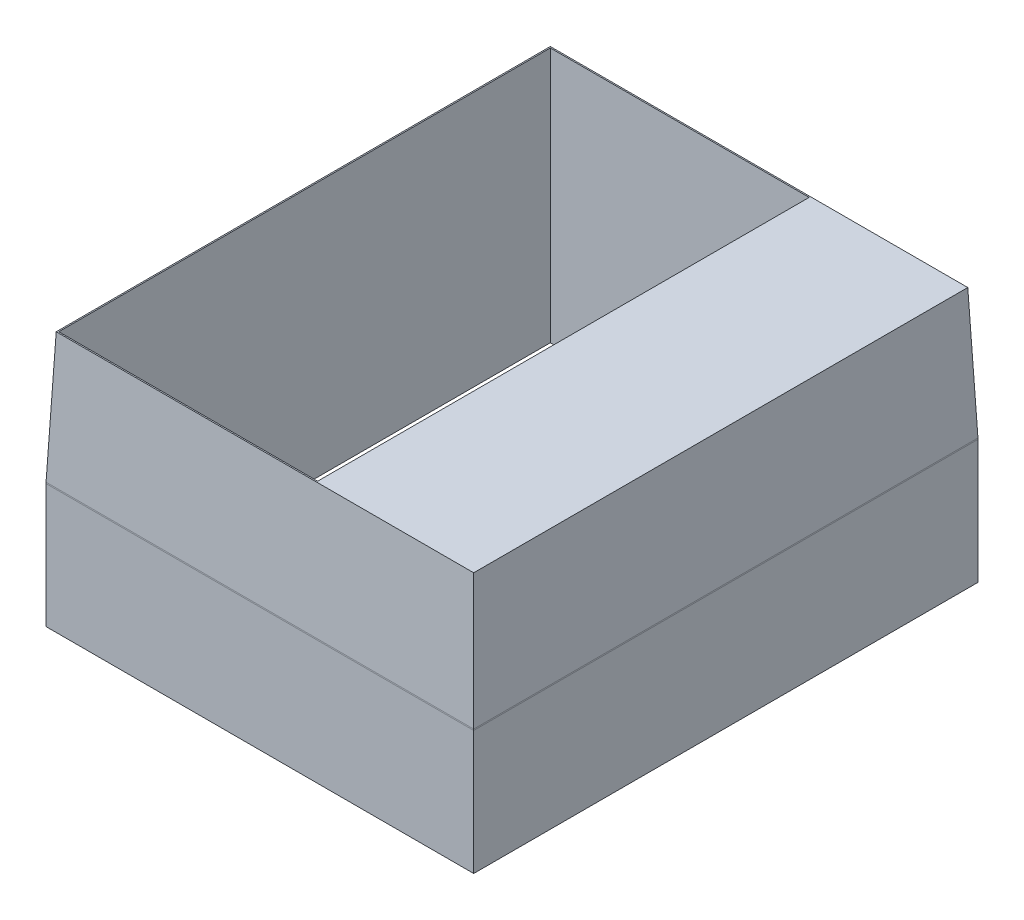
ISO-10303-21;
HEADER;
FILE_DESCRIPTION(('STEP AP214'),'2;1');
FILE_NAME('part.step','',(''),(''),'','','');
FILE_SCHEMA(('AUTOMOTIVE_DESIGN { 1 0 10303 214 1 1 1 1 }'));
ENDSEC;
DATA;
#1=APPLICATION_CONTEXT('core data for automotive mechanical design processes');
#2=APPLICATION_PROTOCOL_DEFINITION('international standard','automotive_design',2000,#1);
#3=PRODUCT_CONTEXT('',#1,'mechanical');
#4=PRODUCT('Part','Part','',(#3));
#5=PRODUCT_RELATED_PRODUCT_CATEGORY('part','',(#4));
#6=PRODUCT_DEFINITION_FORMATION('','',#4);
#7=PRODUCT_DEFINITION_CONTEXT('part definition',#1,'design');
#8=PRODUCT_DEFINITION('design','',#6,#7);
#9=PRODUCT_DEFINITION_SHAPE('','',#8);
#10=(LENGTH_UNIT() NAMED_UNIT(*) SI_UNIT(.MILLI.,.METRE.));
#11=(NAMED_UNIT(*) PLANE_ANGLE_UNIT() SI_UNIT($,.RADIAN.));
#12=(NAMED_UNIT(*) SI_UNIT($,.STERADIAN.) SOLID_ANGLE_UNIT());
#13=UNCERTAINTY_MEASURE_WITH_UNIT(LENGTH_MEASURE(1.E-05),#10,'distance_accuracy_value','');
#14=(GEOMETRIC_REPRESENTATION_CONTEXT(3) GLOBAL_UNCERTAINTY_ASSIGNED_CONTEXT((#13)) GLOBAL_UNIT_ASSIGNED_CONTEXT((#10,
#11,#12)) REPRESENTATION_CONTEXT('',''));
#15=CARTESIAN_POINT('',(0.,0.,0.));
#16=DIRECTION('',(0.,0.,1.));
#17=DIRECTION('',(1.,0.,0.));
#18=AXIS2_PLACEMENT_3D('',#15,#16,#17);
#19=CARTESIAN_POINT('',(0.,40.,0.));
#20=DIRECTION('',(0.,1.,0.));
#21=DIRECTION('',(0.,0.,1.));
#22=AXIS2_PLACEMENT_3D('',#19,#20,#21);
#23=PLANE('',#22);
#24=DIRECTION('',(0.,0.,-1.));
#25=VECTOR('',#24,1.);
#26=CARTESIAN_POINT('',(65.2,40.,-78.));
#27=LINE('',#26,#25);
#28=CARTESIAN_POINT('',(65.2,40.,0.200000000000001));
#29=VERTEX_POINT('',#28);
#30=CARTESIAN_POINT('',(65.2,40.,-77.2));
#31=VERTEX_POINT('',#30);
#32=EDGE_CURVE('E191',#29,#31,#27,.T.);
#33=ORIENTED_EDGE('',*,*,#32,.T.);
#34=DIRECTION('',(-1.,0.,0.));
#35=VECTOR('',#34,1.);
#36=CARTESIAN_POINT('',(-1.,40.,-77.2));
#37=LINE('',#36,#35);
#38=CARTESIAN_POINT('',(-0.200000000000001,40.,-77.2));
#39=VERTEX_POINT('',#38);
#40=EDGE_CURVE('E193',#31,#39,#37,.T.);
#41=ORIENTED_EDGE('',*,*,#40,.T.);
#42=DIRECTION('',(0.,0.,1.));
#43=VECTOR('',#42,1.);
#44=CARTESIAN_POINT('',(-0.199999999999992,40.,1.));
#45=LINE('',#44,#43);
#46=CARTESIAN_POINT('',(-0.199999999999992,40.,0.200000000000001));
#47=VERTEX_POINT('',#46);
#48=EDGE_CURVE('E186',#39,#47,#45,.T.);
#49=ORIENTED_EDGE('',*,*,#48,.T.);
#50=DIRECTION('',(1.,0.,0.));
#51=VECTOR('',#50,1.);
#52=CARTESIAN_POINT('',(66.,40.,0.200000000000001));
#53=LINE('',#52,#51);
#54=EDGE_CURVE('E189',#47,#29,#53,.T.);
#55=ORIENTED_EDGE('',*,*,#54,.T.);
#56=EDGE_LOOP('',(#33,#41,#49,#55));
#57=FACE_BOUND('',#56,.T.);
#58=DIRECTION('',(1.,0.,0.));
#59=VECTOR('',#58,1.);
#60=CARTESIAN_POINT('',(0.,40.,0.));
#61=LINE('',#60,#59);
#62=CARTESIAN_POINT('',(0.,40.,0.));
#63=VERTEX_POINT('',#62);
#64=CARTESIAN_POINT('',(40.55,40.,0.));
#65=VERTEX_POINT('',#64);
#66=EDGE_CURVE('E135',#63,#65,#61,.T.);
#67=ORIENTED_EDGE('',*,*,#66,.F.);
#68=DIRECTION('',(0.,0.,1.));
#69=VECTOR('',#68,1.);
#70=CARTESIAN_POINT('',(0.,40.,0.));
#71=LINE('',#70,#69);
#72=CARTESIAN_POINT('',(0.,40.,-77.));
#73=VERTEX_POINT('',#72);
#74=EDGE_CURVE('E125',#73,#63,#71,.T.);
#75=ORIENTED_EDGE('',*,*,#74,.F.);
#76=DIRECTION('',(-1.,0.,0.));
#77=VECTOR('',#76,1.);
#78=CARTESIAN_POINT('',(0.,40.,-77.));
#79=LINE('',#78,#77);
#80=CARTESIAN_POINT('',(40.55,40.,-77.));
#81=VERTEX_POINT('',#80);
#82=EDGE_CURVE('E150',#81,#73,#79,.T.);
#83=ORIENTED_EDGE('',*,*,#82,.F.);
#84=DIRECTION('',(0.,0.,-1.));
#85=VECTOR('',#84,1.);
#86=CARTESIAN_POINT('',(40.55,40.,0.));
#87=LINE('',#86,#85);
#88=EDGE_CURVE('E148',#65,#81,#87,.T.);
#89=ORIENTED_EDGE('',*,*,#88,.F.);
#90=EDGE_LOOP('',(#67,#75,#83,#89));
#91=FACE_BOUND('',#90,.T.);
#92=ADVANCED_FACE('F33',(#57,#91),#23,.T.);
#93=CARTESIAN_POINT('',(0.,0.,0.));
#94=DIRECTION('',(0.,1.,0.));
#95=DIRECTION('',(0.,0.,1.));
#96=AXIS2_PLACEMENT_3D('',#93,#94,#95);
#97=PLANE('',#96);
#98=DIRECTION('',(0.,0.,1.));
#99=VECTOR('',#98,1.);
#100=CARTESIAN_POINT('',(-1.,0.,-78.));
#101=LINE('',#100,#99);
#102=CARTESIAN_POINT('',(-1.,0.,-78.));
#103=VERTEX_POINT('',#102);
#104=CARTESIAN_POINT('',(-0.99999999999999,0.,1.));
#105=VERTEX_POINT('',#104);
#106=EDGE_CURVE('E143',#103,#105,#101,.T.);
#107=ORIENTED_EDGE('',*,*,#106,.F.);
#108=DIRECTION('',(-1.,0.,0.));
#109=VECTOR('',#108,1.);
#110=CARTESIAN_POINT('',(-1.,0.,-78.));
#111=LINE('',#110,#109);
#112=CARTESIAN_POINT('',(66.,0.,-78.));
#113=VERTEX_POINT('',#112);
#114=EDGE_CURVE('E175',#113,#103,#111,.T.);
#115=ORIENTED_EDGE('',*,*,#114,.F.);
#116=DIRECTION('',(0.,0.,-1.));
#117=VECTOR('',#116,1.);
#118=CARTESIAN_POINT('',(66.,0.,-78.));
#119=LINE('',#118,#117);
#120=CARTESIAN_POINT('',(66.,0.,1.));
#121=VERTEX_POINT('',#120);
#122=EDGE_CURVE('E172',#121,#113,#119,.T.);
#123=ORIENTED_EDGE('',*,*,#122,.F.);
#124=DIRECTION('',(1.,0.,0.));
#125=VECTOR('',#124,1.);
#126=CARTESIAN_POINT('',(-0.99999999999999,0.,1.));
#127=LINE('',#126,#125);
#128=EDGE_CURVE('E169',#105,#121,#127,.T.);
#129=ORIENTED_EDGE('',*,*,#128,.F.);
#130=EDGE_LOOP('',(#107,#115,#123,#129));
#131=FACE_BOUND('',#130,.T.);
#132=DIRECTION('',(0.,0.,1.));
#133=VECTOR('',#132,1.);
#134=CARTESIAN_POINT('',(0.,0.,0.));
#135=LINE('',#134,#133);
#136=CARTESIAN_POINT('',(0.,0.,-77.));
#137=VERTEX_POINT('',#136);
#138=CARTESIAN_POINT('',(0.,0.,0.));
#139=VERTEX_POINT('',#138);
#140=EDGE_CURVE('E154',#137,#139,#135,.T.);
#141=ORIENTED_EDGE('',*,*,#140,.T.);
#142=DIRECTION('',(1.,0.,0.));
#143=VECTOR('',#142,1.);
#144=CARTESIAN_POINT('',(0.,0.,0.));
#145=LINE('',#144,#143);
#146=CARTESIAN_POINT('',(40.55,0.,0.));
#147=VERTEX_POINT('',#146);
#148=EDGE_CURVE('E142',#139,#147,#145,.T.);
#149=ORIENTED_EDGE('',*,*,#148,.T.);
#150=DIRECTION('',(0.,0.,-1.));
#151=VECTOR('',#150,1.);
#152=CARTESIAN_POINT('',(40.55,0.,0.));
#153=LINE('',#152,#151);
#154=CARTESIAN_POINT('',(40.55,0.,-77.));
#155=VERTEX_POINT('',#154);
#156=EDGE_CURVE('E158',#147,#155,#153,.T.);
#157=ORIENTED_EDGE('',*,*,#156,.T.);
#158=DIRECTION('',(-1.,0.,0.));
#159=VECTOR('',#158,1.);
#160=CARTESIAN_POINT('',(0.,0.,-77.));
#161=LINE('',#160,#159);
#162=EDGE_CURVE('E136',#155,#137,#161,.T.);
#163=ORIENTED_EDGE('',*,*,#162,.T.);
#164=EDGE_LOOP('',(#141,#149,#157,#163));
#165=FACE_BOUND('',#164,.T.);
#166=ADVANCED_FACE('F259',(#131,#165),#97,.F.);
#167=CARTESIAN_POINT('',(-1.,40.,-78.));
#168=DIRECTION('',(1.,0.,0.));
#169=DIRECTION('',(0.,0.,-1.));
#170=AXIS2_PLACEMENT_3D('',#167,#168,#169);
#171=PLANE('',#170);
#172=DIRECTION('',(0.,-1.,0.));
#173=VECTOR('',#172,1.);
#174=CARTESIAN_POINT('',(-0.99999999999999,40.,1.));
#175=LINE('',#174,#173);
#176=CARTESIAN_POINT('',(-0.99999999999999,19.4024761401085,1.));
#177=VERTEX_POINT('',#176);
#178=EDGE_CURVE('E184',#177,#105,#175,.T.);
#179=ORIENTED_EDGE('',*,*,#178,.F.);
#180=DIRECTION('',(0.,0.,-1.));
#181=VECTOR('',#180,1.);
#182=CARTESIAN_POINT('',(-1.,19.4024761401085,-78.));
#183=LINE('',#182,#181);
#184=CARTESIAN_POINT('',(-1.,19.4024761401085,-78.));
#185=VERTEX_POINT('',#184);
#186=EDGE_CURVE('E215',#177,#185,#183,.T.);
#187=ORIENTED_EDGE('',*,*,#186,.T.);
#188=DIRECTION('',(0.,-1.,0.));
#189=VECTOR('',#188,1.);
#190=CARTESIAN_POINT('',(-1.,40.,-78.));
#191=LINE('',#190,#189);
#192=EDGE_CURVE('E178',#185,#103,#191,.T.);
#193=ORIENTED_EDGE('',*,*,#192,.T.);
#194=ORIENTED_EDGE('',*,*,#106,.T.);
#195=EDGE_LOOP('',(#179,#187,#193,#194));
#196=FACE_BOUND('',#195,.T.);
#197=ADVANCED_FACE('F265',(#196),#171,.F.);
#198=CARTESIAN_POINT('',(-0.99999999999999,40.,1.));
#199=DIRECTION('',(0.,0.,-1.));
#200=DIRECTION('',(-1.,0.,0.));
#201=AXIS2_PLACEMENT_3D('',#198,#199,#200);
#202=PLANE('',#201);
#203=DIRECTION('',(0.,-1.,0.));
#204=VECTOR('',#203,1.);
#205=CARTESIAN_POINT('',(66.,40.,1.));
#206=LINE('',#205,#204);
#207=CARTESIAN_POINT('',(66.,19.4024761401085,1.));
#208=VERTEX_POINT('',#207);
#209=EDGE_CURVE('E182',#208,#121,#206,.T.);
#210=ORIENTED_EDGE('',*,*,#209,.F.);
#211=DIRECTION('',(-1.,0.,0.));
#212=VECTOR('',#211,1.);
#213=CARTESIAN_POINT('',(-0.99999999999999,19.4024761401085,1.));
#214=LINE('',#213,#212);
#215=EDGE_CURVE('E42',#208,#177,#214,.T.);
#216=ORIENTED_EDGE('',*,*,#215,.T.);
#217=ORIENTED_EDGE('',*,*,#178,.T.);
#218=ORIENTED_EDGE('',*,*,#128,.T.);
#219=EDGE_LOOP('',(#210,#216,#217,#218));
#220=FACE_BOUND('',#219,.T.);
#221=ADVANCED_FACE('F253',(#220),#202,.F.);
#222=CARTESIAN_POINT('',(66.,40.,-78.));
#223=DIRECTION('',(-1.,0.,0.));
#224=DIRECTION('',(0.,0.,1.));
#225=AXIS2_PLACEMENT_3D('',#222,#223,#224);
#226=PLANE('',#225);
#227=DIRECTION('',(0.,-1.,0.));
#228=VECTOR('',#227,1.);
#229=CARTESIAN_POINT('',(66.,40.,-78.));
#230=LINE('',#229,#228);
#231=CARTESIAN_POINT('',(66.,19.4024761401088,-78.));
#232=VERTEX_POINT('',#231);
#233=EDGE_CURVE('E180',#232,#113,#230,.T.);
#234=ORIENTED_EDGE('',*,*,#233,.F.);
#235=DIRECTION('',(0.,0.,1.));
#236=VECTOR('',#235,1.);
#237=CARTESIAN_POINT('',(66.,19.4024761401084,0.999999999999972));
#238=LINE('',#237,#236);
#239=EDGE_CURVE('E196',#232,#208,#238,.T.);
#240=ORIENTED_EDGE('',*,*,#239,.T.);
#241=ORIENTED_EDGE('',*,*,#209,.T.);
#242=ORIENTED_EDGE('',*,*,#122,.T.);
#243=EDGE_LOOP('',(#234,#240,#241,#242));
#244=FACE_BOUND('',#243,.T.);
#245=ADVANCED_FACE('F252',(#244),#226,.F.);
#246=CARTESIAN_POINT('',(-1.,40.,-78.));
#247=DIRECTION('',(0.,0.,1.));
#248=DIRECTION('',(1.,0.,0.));
#249=AXIS2_PLACEMENT_3D('',#246,#247,#248);
#250=PLANE('',#249);
#251=ORIENTED_EDGE('',*,*,#192,.F.);
#252=DIRECTION('',(1.,0.,0.));
#253=VECTOR('',#252,1.);
#254=CARTESIAN_POINT('',(66.,19.4024761401088,-78.));
#255=LINE('',#254,#253);
#256=EDGE_CURVE('E211',#185,#232,#255,.T.);
#257=ORIENTED_EDGE('',*,*,#256,.T.);
#258=ORIENTED_EDGE('',*,*,#233,.T.);
#259=ORIENTED_EDGE('',*,*,#114,.T.);
#260=EDGE_LOOP('',(#251,#257,#258,#259));
#261=FACE_BOUND('',#260,.T.);
#262=ADVANCED_FACE('F263',(#261),#250,.F.);
#263=CARTESIAN_POINT('',(0.,40.,0.));
#264=DIRECTION('',(1.,0.,0.));
#265=DIRECTION('',(0.,0.,-1.));
#266=AXIS2_PLACEMENT_3D('',#263,#264,#265);
#267=PLANE('',#266);
#268=ORIENTED_EDGE('',*,*,#140,.F.);
#269=DIRECTION('',(0.,-1.,0.));
#270=VECTOR('',#269,1.);
#271=CARTESIAN_POINT('',(0.,40.,-77.));
#272=LINE('',#271,#270);
#273=EDGE_CURVE('E131',#73,#137,#272,.T.);
#274=ORIENTED_EDGE('',*,*,#273,.F.);
#275=ORIENTED_EDGE('',*,*,#74,.T.);
#276=DIRECTION('',(0.,-1.,0.));
#277=VECTOR('',#276,1.);
#278=CARTESIAN_POINT('',(0.,40.,0.));
#279=LINE('',#278,#277);
#280=EDGE_CURVE('E128',#63,#139,#279,.T.);
#281=ORIENTED_EDGE('',*,*,#280,.T.);
#282=EDGE_LOOP('',(#268,#274,#275,#281));
#283=FACE_BOUND('',#282,.T.);
#284=ADVANCED_FACE('F127',(#283),#267,.T.);
#285=CARTESIAN_POINT('',(0.,40.,0.));
#286=DIRECTION('',(0.,0.,-1.));
#287=DIRECTION('',(-1.,0.,0.));
#288=AXIS2_PLACEMENT_3D('',#285,#286,#287);
#289=PLANE('',#288);
#290=ORIENTED_EDGE('',*,*,#148,.F.);
#291=ORIENTED_EDGE('',*,*,#280,.F.);
#292=ORIENTED_EDGE('',*,*,#66,.T.);
#293=DIRECTION('',(0.,-1.,0.));
#294=VECTOR('',#293,1.);
#295=CARTESIAN_POINT('',(40.55,40.,0.));
#296=LINE('',#295,#294);
#297=EDGE_CURVE('E144',#65,#147,#296,.T.);
#298=ORIENTED_EDGE('',*,*,#297,.T.);
#299=EDGE_LOOP('',(#290,#291,#292,#298));
#300=FACE_BOUND('',#299,.T.);
#301=ADVANCED_FACE('F139',(#300),#289,.T.);
#302=CARTESIAN_POINT('',(40.55,40.,0.));
#303=DIRECTION('',(-1.,0.,0.));
#304=DIRECTION('',(0.,0.,1.));
#305=AXIS2_PLACEMENT_3D('',#302,#303,#304);
#306=PLANE('',#305);
#307=ORIENTED_EDGE('',*,*,#156,.F.);
#308=ORIENTED_EDGE('',*,*,#297,.F.);
#309=ORIENTED_EDGE('',*,*,#88,.T.);
#310=DIRECTION('',(0.,-1.,0.));
#311=VECTOR('',#310,1.);
#312=CARTESIAN_POINT('',(40.55,40.,-77.));
#313=LINE('',#312,#311);
#314=EDGE_CURVE('E164',#81,#155,#313,.T.);
#315=ORIENTED_EDGE('',*,*,#314,.T.);
#316=EDGE_LOOP('',(#307,#308,#309,#315));
#317=FACE_BOUND('',#316,.T.);
#318=ADVANCED_FACE('F307',(#317),#306,.T.);
#319=CARTESIAN_POINT('',(0.,40.,-77.));
#320=DIRECTION('',(0.,0.,1.));
#321=DIRECTION('',(1.,0.,0.));
#322=AXIS2_PLACEMENT_3D('',#319,#320,#321);
#323=PLANE('',#322);
#324=ORIENTED_EDGE('',*,*,#162,.F.);
#325=ORIENTED_EDGE('',*,*,#314,.F.);
#326=ORIENTED_EDGE('',*,*,#82,.T.);
#327=ORIENTED_EDGE('',*,*,#273,.T.);
#328=EDGE_LOOP('',(#324,#325,#326,#327));
#329=FACE_BOUND('',#328,.T.);
#330=ADVANCED_FACE('F313',(#329),#323,.T.);
#331=CARTESIAN_POINT('',(0.,40.,0.200000000000001));
#332=DIRECTION('',(0.,0.0389947089597387,0.999239417093394));
#333=DIRECTION('',(-1.,0.,0.));
#334=AXIS2_PLACEMENT_3D('',#331,#332,#333);
#335=PLANE('',#334);
#336=DIRECTION('',(0.0389650952979522,0.998480567010116,-0.0389650952979522));
#337=VECTOR('',#336,1.);
#338=CARTESIAN_POINT('',(-0.199696344269676,40.0077811780893,0.199696344269686));
#339=LINE('',#338,#337);
#340=CARTESIAN_POINT('',(-0.996197085466958,19.5974496849072,0.996197085466968));
#341=VERTEX_POINT('',#340);
#342=EDGE_CURVE('E202',#341,#47,#339,.T.);
#343=ORIENTED_EDGE('',*,*,#342,.F.);
#344=DIRECTION('',(-1.,0.,0.));
#345=VECTOR('',#344,1.);
#346=CARTESIAN_POINT('',(66.,19.5974496849072,0.996197085466966));
#347=LINE('',#346,#345);
#348=CARTESIAN_POINT('',(65.996197085467,19.5974496849072,0.996197085466968));
#349=VERTEX_POINT('',#348);
#350=EDGE_CURVE('E11',#341,#349,#347,.F.);
#351=ORIENTED_EDGE('',*,*,#350,.T.);
#352=DIRECTION('',(-0.0389650952979514,0.998480567010116,-0.0389650952979522));
#353=VECTOR('',#352,1.);
#354=CARTESIAN_POINT('',(65.1010082319171,42.536664057125,0.101008231917085));
#355=LINE('',#354,#353);
#356=EDGE_CURVE('E156',#29,#349,#355,.F.);
#357=ORIENTED_EDGE('',*,*,#356,.F.);
#358=ORIENTED_EDGE('',*,*,#54,.F.);
#359=EDGE_LOOP('',(#343,#351,#357,#358));
#360=FACE_BOUND('',#359,.T.);
#361=ADVANCED_FACE('F240',(#360),#335,.T.);
#362=CARTESIAN_POINT('',(65.2,40.,0.));
#363=DIRECTION('',(0.999239417093394,0.0389947089597378,0.));
#364=DIRECTION('',(0.,0.,1.));
#365=AXIS2_PLACEMENT_3D('',#362,#363,#364);
#366=PLANE('',#365);
#367=ORIENTED_EDGE('',*,*,#356,.T.);
#368=DIRECTION('',(0.,0.,1.));
#369=VECTOR('',#368,1.);
#370=CARTESIAN_POINT('',(65.996197085467,19.5974496849071,-78.));
#371=LINE('',#370,#369);
#372=CARTESIAN_POINT('',(65.9961970854669,19.5974496849074,-77.9961970854669));
#373=VERTEX_POINT('',#372);
#374=EDGE_CURVE('E208',#349,#373,#371,.F.);
#375=ORIENTED_EDGE('',*,*,#374,.T.);
#376=DIRECTION('',(-0.0389650952979514,0.998480567010116,0.0389650952979521));
#377=VECTOR('',#376,1.);
#378=CARTESIAN_POINT('',(65.0827888880982,43.0035347424854,-77.0827888880981));
#379=LINE('',#378,#377);
#380=EDGE_CURVE('E199',#31,#373,#379,.F.);
#381=ORIENTED_EDGE('',*,*,#380,.F.);
#382=ORIENTED_EDGE('',*,*,#32,.F.);
#383=EDGE_LOOP('',(#367,#375,#381,#382));
#384=FACE_BOUND('',#383,.T.);
#385=ADVANCED_FACE('F245',(#384),#366,.T.);
#386=CARTESIAN_POINT('',(-0.199999999999992,40.,0.));
#387=DIRECTION('',(-0.999239417093394,0.0389947089597387,0.));
#388=DIRECTION('',(0.,0.,-1.));
#389=AXIS2_PLACEMENT_3D('',#386,#387,#388);
#390=PLANE('',#389);
#391=DIRECTION('',(-0.0389650952979523,-0.998480567010116,-0.0389650952979521));
#392=VECTOR('',#391,1.);
#393=CARTESIAN_POINT('',(-0.0827888880981416,43.0035347424854,-77.0827888880982));
#394=LINE('',#393,#392);
#395=CARTESIAN_POINT('',(-0.996197085466968,19.5974496849072,-77.996197085467));
#396=VERTEX_POINT('',#395);
#397=EDGE_CURVE('E197',#396,#39,#394,.F.);
#398=ORIENTED_EDGE('',*,*,#397,.F.);
#399=DIRECTION('',(0.,0.,-1.));
#400=VECTOR('',#399,1.);
#401=CARTESIAN_POINT('',(-0.996197085466956,19.5974496849072,0.999999999999974));
#402=LINE('',#401,#400);
#403=EDGE_CURVE('E50',#396,#341,#402,.F.);
#404=ORIENTED_EDGE('',*,*,#403,.T.);
#405=ORIENTED_EDGE('',*,*,#342,.T.);
#406=ORIENTED_EDGE('',*,*,#48,.F.);
#407=EDGE_LOOP('',(#398,#404,#405,#406));
#408=FACE_BOUND('',#407,.T.);
#409=ADVANCED_FACE('F333',(#408),#390,.T.);
#410=CARTESIAN_POINT('',(0.,40.,-77.2));
#411=DIRECTION('',(0.,0.0389947089597385,-0.999239417093394));
#412=DIRECTION('',(1.,0.,0.));
#413=AXIS2_PLACEMENT_3D('',#410,#411,#412);
#414=PLANE('',#413);
#415=ORIENTED_EDGE('',*,*,#380,.T.);
#416=DIRECTION('',(1.,0.,0.));
#417=VECTOR('',#416,1.);
#418=CARTESIAN_POINT('',(-1.,19.5974496849074,-77.996197085467));
#419=LINE('',#418,#417);
#420=EDGE_CURVE('E213',#373,#396,#419,.F.);
#421=ORIENTED_EDGE('',*,*,#420,.T.);
#422=ORIENTED_EDGE('',*,*,#397,.T.);
#423=ORIENTED_EDGE('',*,*,#40,.F.);
#424=EDGE_LOOP('',(#415,#421,#422,#423));
#425=FACE_BOUND('',#424,.T.);
#426=ADVANCED_FACE('F340',(#425),#414,.T.);
#427=CARTESIAN_POINT('',(4.,19.4024761401085,-78.));
#428=DIRECTION('',(0.,0.,1.));
#429=DIRECTION('',(1.,0.,0.));
#430=AXIS2_PLACEMENT_3D('',#427,#428,#429);
#431=CYLINDRICAL_SURFACE('',#430,5.);
#432=CARTESIAN_POINT('',(4.00000000000001,19.4024761401085,-4.00000000000002));
#433=DIRECTION('',(0.707106781186548,0.,0.707106781186547));
#434=DIRECTION('',(0.707106781186547,0.,-0.707106781186547));
#435=AXIS2_PLACEMENT_3D('',#432,#433,#434);
#436=ELLIPSE('',#435,7.07106781186547,5.);
#437=EDGE_CURVE('E222',#341,#177,#436,.T.);
#438=ORIENTED_EDGE('',*,*,#437,.F.);
#439=ORIENTED_EDGE('',*,*,#403,.F.);
#440=CARTESIAN_POINT('',(4.,19.4024761401086,-73.));
#441=DIRECTION('',(-0.707106781186547,0.,0.707106781186547));
#442=DIRECTION('',(0.707106781186548,0.,0.707106781186547));
#443=AXIS2_PLACEMENT_3D('',#440,#441,#442);
#444=ELLIPSE('',#443,7.07106781186548,5.);
#445=EDGE_CURVE('E37',#185,#396,#444,.F.);
#446=ORIENTED_EDGE('',*,*,#445,.F.);
#447=ORIENTED_EDGE('',*,*,#186,.F.);
#448=EDGE_LOOP('',(#438,#439,#446,#447));
#449=FACE_BOUND('',#448,.T.);
#450=ADVANCED_FACE('F35',(#449),#431,.T.);
#451=CARTESIAN_POINT('',(-1.,19.4024761401088,-73.));
#452=DIRECTION('',(-1.,0.,0.));
#453=DIRECTION('',(0.,0.,1.));
#454=AXIS2_PLACEMENT_3D('',#451,#452,#453);
#455=CYLINDRICAL_SURFACE('',#454,5.);
#456=ORIENTED_EDGE('',*,*,#445,.T.);
#457=ORIENTED_EDGE('',*,*,#420,.F.);
#458=CARTESIAN_POINT('',(61.,19.4024761401086,-73.));
#459=DIRECTION('',(-0.707106781186548,0.,-0.707106781186547));
#460=DIRECTION('',(-0.707106781186547,0.,0.707106781186547));
#461=AXIS2_PLACEMENT_3D('',#458,#459,#460);
#462=ELLIPSE('',#461,7.07106781186547,5.);
#463=EDGE_CURVE('E221',#232,#373,#462,.F.);
#464=ORIENTED_EDGE('',*,*,#463,.F.);
#465=ORIENTED_EDGE('',*,*,#256,.F.);
#466=EDGE_LOOP('',(#456,#457,#464,#465));
#467=FACE_BOUND('',#466,.T.);
#468=ADVANCED_FACE('F232',(#467),#455,.T.);
#469=CARTESIAN_POINT('',(-0.99999999999999,19.4024761401085,-4.));
#470=DIRECTION('',(1.,0.,0.));
#471=DIRECTION('',(0.,0.,-1.));
#472=AXIS2_PLACEMENT_3D('',#469,#470,#471);
#473=CYLINDRICAL_SURFACE('',#472,5.);
#474=ORIENTED_EDGE('',*,*,#437,.T.);
#475=ORIENTED_EDGE('',*,*,#215,.F.);
#476=CARTESIAN_POINT('',(61.,19.4024761401084,-4.00000000000002));
#477=DIRECTION('',(0.707106781186547,0.,-0.707106781186548));
#478=DIRECTION('',(0.707106781186548,0.,0.707106781186547));
#479=AXIS2_PLACEMENT_3D('',#476,#477,#478);
#480=ELLIPSE('',#479,7.07106781186548,5.);
#481=EDGE_CURVE('E219',#349,#208,#480,.T.);
#482=ORIENTED_EDGE('',*,*,#481,.F.);
#483=ORIENTED_EDGE('',*,*,#350,.F.);
#484=EDGE_LOOP('',(#474,#475,#482,#483));
#485=FACE_BOUND('',#484,.T.);
#486=ADVANCED_FACE('F237',(#485),#473,.T.);
#487=CARTESIAN_POINT('',(61.,19.4024761401084,-78.));
#488=DIRECTION('',(0.,0.,-1.));
#489=DIRECTION('',(-1.,0.,0.));
#490=AXIS2_PLACEMENT_3D('',#487,#488,#489);
#491=CYLINDRICAL_SURFACE('',#490,5.);
#492=ORIENTED_EDGE('',*,*,#463,.T.);
#493=ORIENTED_EDGE('',*,*,#374,.F.);
#494=ORIENTED_EDGE('',*,*,#481,.T.);
#495=ORIENTED_EDGE('',*,*,#239,.F.);
#496=EDGE_LOOP('',(#492,#493,#494,#495));
#497=FACE_BOUND('',#496,.T.);
#498=ADVANCED_FACE('F248',(#497),#491,.T.);
#499=CLOSED_SHELL('',(#92,#166,#197,#221,#245,#262,#284,#301,#318,#330,#361,#385,#409,#426,#450,
#468,#486,#498));
#500=MANIFOLD_SOLID_BREP('B2',#499);
#501=ADVANCED_BREP_SHAPE_REPRESENTATION('',(#18,#500),#14);
#502=SHAPE_DEFINITION_REPRESENTATION(#9,#501);
ENDSEC;
END-ISO-10303-21;
